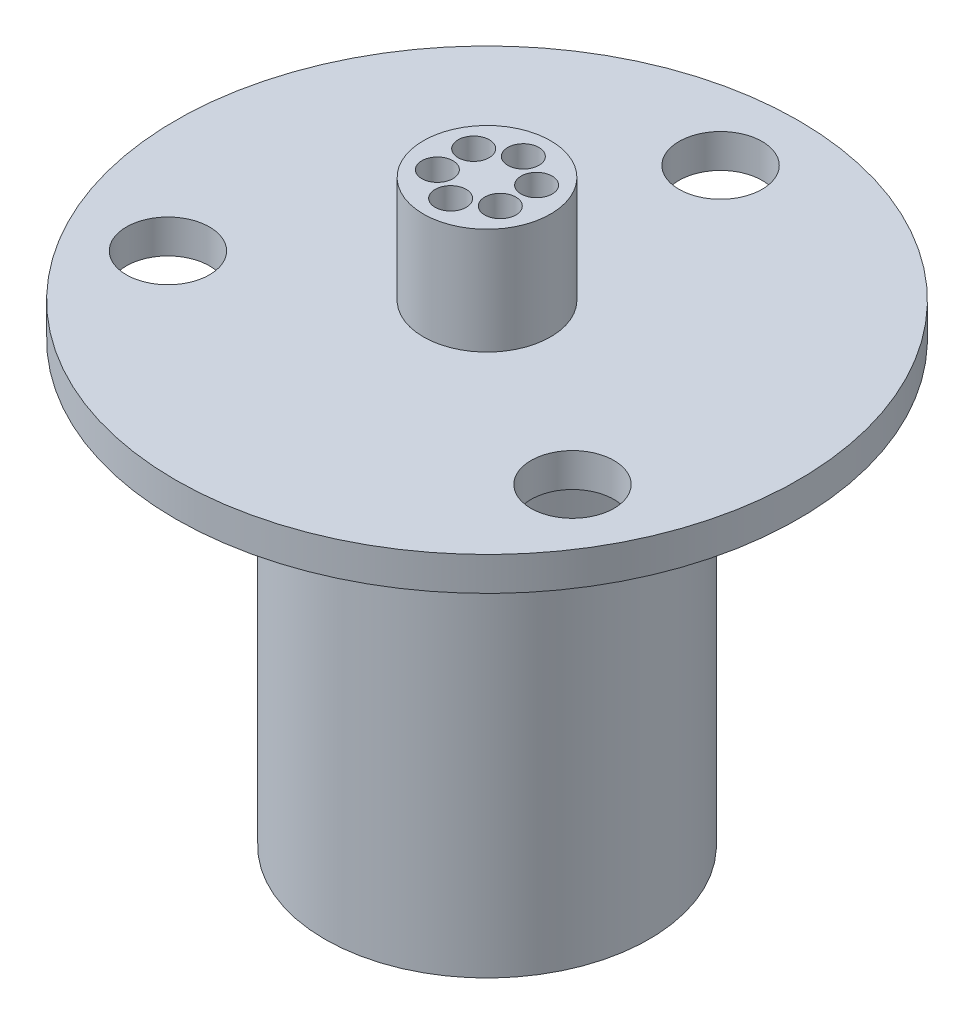
ISO-10303-21;
HEADER;
FILE_DESCRIPTION(('STEP AP214'),'2;1');
FILE_NAME('part.step','',(''),(''),'','','');
FILE_SCHEMA(('AUTOMOTIVE_DESIGN { 1 0 10303 214 1 1 1 1 }'));
ENDSEC;
DATA;
#1=APPLICATION_CONTEXT('core data for automotive mechanical design processes');
#2=APPLICATION_PROTOCOL_DEFINITION('international standard','automotive_design',2000,#1);
#3=PRODUCT_CONTEXT('',#1,'mechanical');
#4=PRODUCT('Part','Part','',(#3));
#5=PRODUCT_RELATED_PRODUCT_CATEGORY('part','',(#4));
#6=PRODUCT_DEFINITION_FORMATION('','',#4);
#7=PRODUCT_DEFINITION_CONTEXT('part definition',#1,'design');
#8=PRODUCT_DEFINITION('design','',#6,#7);
#9=PRODUCT_DEFINITION_SHAPE('','',#8);
#10=(LENGTH_UNIT() NAMED_UNIT(*) SI_UNIT(.MILLI.,.METRE.));
#11=(NAMED_UNIT(*) PLANE_ANGLE_UNIT() SI_UNIT($,.RADIAN.));
#12=(NAMED_UNIT(*) SI_UNIT($,.STERADIAN.) SOLID_ANGLE_UNIT());
#13=UNCERTAINTY_MEASURE_WITH_UNIT(LENGTH_MEASURE(1.E-05),#10,'distance_accuracy_value','');
#14=(GEOMETRIC_REPRESENTATION_CONTEXT(3) GLOBAL_UNCERTAINTY_ASSIGNED_CONTEXT((#13)) GLOBAL_UNIT_ASSIGNED_CONTEXT((#10,
#11,#12)) REPRESENTATION_CONTEXT('',''));
#15=CARTESIAN_POINT('',(0.,0.,0.));
#16=DIRECTION('',(0.,0.,1.));
#17=DIRECTION('',(1.,0.,0.));
#18=AXIS2_PLACEMENT_3D('',#15,#16,#17);
#19=CARTESIAN_POINT('',(0.,16.9,0.));
#20=DIRECTION('',(0.,-1.,0.));
#21=DIRECTION('',(0.,0.,-1.));
#22=AXIS2_PLACEMENT_3D('',#19,#20,#21);
#23=CYLINDRICAL_SURFACE('',#22,6.25);
#24=CARTESIAN_POINT('',(0.,16.9,0.));
#25=DIRECTION('',(0.,1.,0.));
#26=DIRECTION('',(0.,0.,1.));
#27=AXIS2_PLACEMENT_3D('',#24,#25,#26);
#28=CIRCLE('',#27,6.25);
#29=CARTESIAN_POINT('',(0.,16.9,6.25));
#30=VERTEX_POINT('',#29);
#31=EDGE_CURVE('E10',#30,#30,#28,.T.);
#32=ORIENTED_EDGE('',*,*,#31,.F.);
#33=EDGE_LOOP('',(#32));
#34=FACE_BOUND('',#33,.T.);
#35=CARTESIAN_POINT('',(0.,0.,0.));
#36=DIRECTION('',(0.,1.,0.));
#37=DIRECTION('',(0.,0.,1.));
#38=AXIS2_PLACEMENT_3D('',#35,#36,#37);
#39=CIRCLE('',#38,6.25);
#40=CARTESIAN_POINT('',(0.,0.,6.25));
#41=VERTEX_POINT('',#40);
#42=EDGE_CURVE('E51',#41,#41,#39,.T.);
#43=ORIENTED_EDGE('',*,*,#42,.T.);
#44=EDGE_LOOP('',(#43));
#45=FACE_BOUND('',#44,.T.);
#46=ADVANCED_FACE('F43',(#34,#45),#23,.T.);
#47=CARTESIAN_POINT('',(0.,0.,0.));
#48=DIRECTION('',(0.,1.,0.));
#49=DIRECTION('',(0.,0.,1.));
#50=AXIS2_PLACEMENT_3D('',#47,#48,#49);
#51=PLANE('',#50);
#52=CARTESIAN_POINT('',(1.90178217783322,0.,4.07838504166507));
#53=DIRECTION('',(0.,-1.,0.));
#54=DIRECTION('',(0.,0.,-1.));
#55=AXIS2_PLACEMENT_3D('',#52,#53,#54);
#56=CIRCLE('',#55,0.59999999999995);
#57=CARTESIAN_POINT('',(1.90178217783322,0.,3.47838504166512));
#58=VERTEX_POINT('',#57);
#59=EDGE_CURVE('E157',#58,#58,#56,.T.);
#60=ORIENTED_EDGE('',*,*,#59,.F.);
#61=EDGE_LOOP('',(#60));
#62=FACE_BOUND('',#61,.T.);
#63=CARTESIAN_POINT('',(-1.90178217783322,0.,4.07838504166507));
#64=DIRECTION('',(0.,-1.,0.));
#65=DIRECTION('',(0.,0.,1.));
#66=AXIS2_PLACEMENT_3D('',#63,#64,#65);
#67=CIRCLE('',#66,0.59999999999995);
#68=CARTESIAN_POINT('',(-1.90178217783322,0.,4.67838504166502));
#69=VERTEX_POINT('',#68);
#70=EDGE_CURVE('E182',#69,#69,#67,.T.);
#71=ORIENTED_EDGE('',*,*,#70,.F.);
#72=EDGE_LOOP('',(#71));
#73=FACE_BOUND('',#72,.T.);
#74=CARTESIAN_POINT('',(-1.90178217783322,0.,-4.07838504166507));
#75=DIRECTION('',(0.,-1.,0.));
#76=DIRECTION('',(0.,0.,-1.));
#77=AXIS2_PLACEMENT_3D('',#74,#75,#76);
#78=CIRCLE('',#77,0.59999999999995);
#79=CARTESIAN_POINT('',(-1.90178217783322,0.,-4.67838504166502));
#80=VERTEX_POINT('',#79);
#81=EDGE_CURVE('E174',#80,#80,#78,.T.);
#82=ORIENTED_EDGE('',*,*,#81,.F.);
#83=EDGE_LOOP('',(#82));
#84=FACE_BOUND('',#83,.T.);
#85=CARTESIAN_POINT('',(1.90178217783322,0.,-4.07838504166507));
#86=DIRECTION('',(0.,-1.,0.));
#87=DIRECTION('',(0.,0.,1.));
#88=AXIS2_PLACEMENT_3D('',#85,#86,#87);
#89=CIRCLE('',#88,0.59999999999995);
#90=CARTESIAN_POINT('',(1.90178217783322,0.,-3.47838504166512));
#91=VERTEX_POINT('',#90);
#92=EDGE_CURVE('E165',#91,#91,#89,.T.);
#93=ORIENTED_EDGE('',*,*,#92,.F.);
#94=EDGE_LOOP('',(#93));
#95=FACE_BOUND('',#94,.T.);
#96=CARTESIAN_POINT('',(0.,0.,-4.5));
#97=DIRECTION('',(0.,-1.,0.));
#98=DIRECTION('',(0.,0.,1.));
#99=AXIS2_PLACEMENT_3D('',#96,#97,#98);
#100=CIRCLE('',#99,0.6);
#101=CARTESIAN_POINT('',(0.,0.,-3.9));
#102=VERTEX_POINT('',#101);
#103=EDGE_CURVE('E166',#102,#102,#100,.T.);
#104=ORIENTED_EDGE('',*,*,#103,.F.);
#105=EDGE_LOOP('',(#104));
#106=FACE_BOUND('',#105,.T.);
#107=CARTESIAN_POINT('',(0.,0.,4.5));
#108=DIRECTION('',(0.,-1.,0.));
#109=DIRECTION('',(0.,0.,-1.));
#110=AXIS2_PLACEMENT_3D('',#107,#108,#109);
#111=CIRCLE('',#110,0.6);
#112=CARTESIAN_POINT('',(0.,0.,3.9));
#113=VERTEX_POINT('',#112);
#114=EDGE_CURVE('E153',#113,#113,#111,.T.);
#115=ORIENTED_EDGE('',*,*,#114,.F.);
#116=EDGE_LOOP('',(#115));
#117=FACE_BOUND('',#116,.T.);
#118=ORIENTED_EDGE('',*,*,#42,.F.);
#119=EDGE_LOOP('',(#118));
#120=FACE_BOUND('',#119,.T.);
#121=ADVANCED_FACE('F203',(#62,#73,#84,#95,#106,#117,#120),#51,.F.);
#122=CARTESIAN_POINT('',(0.,18.2,0.));
#123=DIRECTION('',(0.,-1.,0.));
#124=DIRECTION('',(0.,0.,-1.));
#125=AXIS2_PLACEMENT_3D('',#122,#123,#124);
#126=CYLINDRICAL_SURFACE('',#125,12.);
#127=CARTESIAN_POINT('',(0.,18.2,0.));
#128=DIRECTION('',(0.,1.,0.));
#129=DIRECTION('',(0.,0.,1.));
#130=AXIS2_PLACEMENT_3D('',#127,#128,#129);
#131=CIRCLE('',#130,12.);
#132=CARTESIAN_POINT('',(0.,18.2,12.));
#133=VERTEX_POINT('',#132);
#134=EDGE_CURVE('E57',#133,#133,#131,.T.);
#135=ORIENTED_EDGE('',*,*,#134,.F.);
#136=EDGE_LOOP('',(#135));
#137=FACE_BOUND('',#136,.T.);
#138=CARTESIAN_POINT('',(0.,16.9,0.));
#139=DIRECTION('',(0.,1.,0.));
#140=DIRECTION('',(0.,0.,1.));
#141=AXIS2_PLACEMENT_3D('',#138,#139,#140);
#142=CIRCLE('',#141,12.);
#143=CARTESIAN_POINT('',(0.,16.9,12.));
#144=VERTEX_POINT('',#143);
#145=EDGE_CURVE('E60',#144,#144,#142,.T.);
#146=ORIENTED_EDGE('',*,*,#145,.T.);
#147=EDGE_LOOP('',(#146));
#148=FACE_BOUND('',#147,.T.);
#149=ADVANCED_FACE('F206',(#137,#148),#126,.T.);
#150=CARTESIAN_POINT('',(0.,18.2,0.));
#151=DIRECTION('',(0.,1.,0.));
#152=DIRECTION('',(0.,0.,1.));
#153=AXIS2_PLACEMENT_3D('',#150,#151,#152);
#154=PLANE('',#153);
#155=CARTESIAN_POINT('',(0.,18.2,0.));
#156=DIRECTION('',(0.,1.,0.));
#157=DIRECTION('',(0.,0.,1.));
#158=AXIS2_PLACEMENT_3D('',#155,#156,#157);
#159=CIRCLE('',#158,2.45);
#160=CARTESIAN_POINT('',(0.,18.2,2.45));
#161=VERTEX_POINT('',#160);
#162=EDGE_CURVE('E97',#161,#161,#159,.T.);
#163=ORIENTED_EDGE('',*,*,#162,.F.);
#164=EDGE_LOOP('',(#163));
#165=FACE_BOUND('',#164,.T.);
#166=CARTESIAN_POINT('',(0.,18.2,-9.));
#167=DIRECTION('',(0.,1.,0.));
#168=DIRECTION('',(0.,0.,1.));
#169=AXIS2_PLACEMENT_3D('',#166,#167,#168);
#170=CIRCLE('',#169,1.6);
#171=CARTESIAN_POINT('',(0.,18.2,-7.4));
#172=VERTEX_POINT('',#171);
#173=EDGE_CURVE('E67',#172,#172,#170,.T.);
#174=ORIENTED_EDGE('',*,*,#173,.F.);
#175=EDGE_LOOP('',(#174));
#176=FACE_BOUND('',#175,.T.);
#177=CARTESIAN_POINT('',(7.79422863406052,18.2,4.49999999999967));
#178=DIRECTION('',(0.,1.,0.));
#179=DIRECTION('',(0.,0.,1.));
#180=AXIS2_PLACEMENT_3D('',#177,#178,#179);
#181=CIRCLE('',#180,1.60000000000049);
#182=CARTESIAN_POINT('',(7.79422863406052,18.2,6.10000000000016));
#183=VERTEX_POINT('',#182);
#184=EDGE_CURVE('E89',#183,#183,#181,.T.);
#185=ORIENTED_EDGE('',*,*,#184,.F.);
#186=EDGE_LOOP('',(#185));
#187=FACE_BOUND('',#186,.T.);
#188=CARTESIAN_POINT('',(-7.79422863405937,18.2,4.50000000000033));
#189=DIRECTION('',(0.,1.,0.));
#190=DIRECTION('',(0.,0.,1.));
#191=AXIS2_PLACEMENT_3D('',#188,#189,#190);
#192=CIRCLE('',#191,1.60000000000073);
#193=CARTESIAN_POINT('',(-7.79422863405937,18.2,6.10000000000106));
#194=VERTEX_POINT('',#193);
#195=EDGE_CURVE('E85',#194,#194,#192,.T.);
#196=ORIENTED_EDGE('',*,*,#195,.F.);
#197=EDGE_LOOP('',(#196));
#198=FACE_BOUND('',#197,.T.);
#199=ORIENTED_EDGE('',*,*,#134,.T.);
#200=EDGE_LOOP('',(#199));
#201=FACE_BOUND('',#200,.T.);
#202=ADVANCED_FACE('F228',(#165,#176,#187,#198,#201),#154,.T.);
#203=CARTESIAN_POINT('',(0.,16.9,0.));
#204=DIRECTION('',(0.,1.,0.));
#205=DIRECTION('',(0.,0.,1.));
#206=AXIS2_PLACEMENT_3D('',#203,#204,#205);
#207=PLANE('',#206);
#208=CARTESIAN_POINT('',(0.,16.9,-9.));
#209=DIRECTION('',(0.,1.,0.));
#210=DIRECTION('',(0.,0.,1.));
#211=AXIS2_PLACEMENT_3D('',#208,#209,#210);
#212=CIRCLE('',#211,1.6);
#213=CARTESIAN_POINT('',(0.,16.9,-7.4));
#214=VERTEX_POINT('',#213);
#215=EDGE_CURVE('E46',#214,#214,#212,.T.);
#216=ORIENTED_EDGE('',*,*,#215,.T.);
#217=EDGE_LOOP('',(#216));
#218=FACE_BOUND('',#217,.T.);
#219=CARTESIAN_POINT('',(7.79422863406052,16.9,4.49999999999967));
#220=DIRECTION('',(0.,1.,0.));
#221=DIRECTION('',(0.,0.,1.));
#222=AXIS2_PLACEMENT_3D('',#219,#220,#221);
#223=CIRCLE('',#222,1.60000000000049);
#224=CARTESIAN_POINT('',(7.79422863406052,16.9,6.10000000000016));
#225=VERTEX_POINT('',#224);
#226=EDGE_CURVE('E66',#225,#225,#223,.T.);
#227=ORIENTED_EDGE('',*,*,#226,.T.);
#228=EDGE_LOOP('',(#227));
#229=FACE_BOUND('',#228,.T.);
#230=CARTESIAN_POINT('',(-7.79422863405937,16.9,4.50000000000033));
#231=DIRECTION('',(0.,1.,0.));
#232=DIRECTION('',(0.,0.,1.));
#233=AXIS2_PLACEMENT_3D('',#230,#231,#232);
#234=CIRCLE('',#233,1.60000000000073);
#235=CARTESIAN_POINT('',(-7.79422863405937,16.9,6.10000000000106));
#236=VERTEX_POINT('',#235);
#237=EDGE_CURVE('E63',#236,#236,#234,.T.);
#238=ORIENTED_EDGE('',*,*,#237,.T.);
#239=EDGE_LOOP('',(#238));
#240=FACE_BOUND('',#239,.T.);
#241=ORIENTED_EDGE('',*,*,#31,.T.);
#242=EDGE_LOOP('',(#241));
#243=FACE_BOUND('',#242,.T.);
#244=ORIENTED_EDGE('',*,*,#145,.F.);
#245=EDGE_LOOP('',(#244));
#246=FACE_BOUND('',#245,.T.);
#247=ADVANCED_FACE('F237',(#218,#229,#240,#243,#246),#207,.F.);
#248=CARTESIAN_POINT('',(-7.79422863405937,0.,4.50000000000033));
#249=DIRECTION('',(0.,1.,0.));
#250=DIRECTION('',(0.,0.,1.));
#251=AXIS2_PLACEMENT_3D('',#248,#249,#250);
#252=CYLINDRICAL_SURFACE('',#251,1.60000000000073);
#253=ORIENTED_EDGE('',*,*,#195,.T.);
#254=EDGE_LOOP('',(#253));
#255=FACE_BOUND('',#254,.T.);
#256=ORIENTED_EDGE('',*,*,#237,.F.);
#257=EDGE_LOOP('',(#256));
#258=FACE_BOUND('',#257,.T.);
#259=ADVANCED_FACE('F246',(#255,#258),#252,.F.);
#260=CARTESIAN_POINT('',(7.79422863406052,0.,4.49999999999967));
#261=DIRECTION('',(0.,1.,0.));
#262=DIRECTION('',(0.,0.,1.));
#263=AXIS2_PLACEMENT_3D('',#260,#261,#262);
#264=CYLINDRICAL_SURFACE('',#263,1.60000000000049);
#265=ORIENTED_EDGE('',*,*,#184,.T.);
#266=EDGE_LOOP('',(#265));
#267=FACE_BOUND('',#266,.T.);
#268=ORIENTED_EDGE('',*,*,#226,.F.);
#269=EDGE_LOOP('',(#268));
#270=FACE_BOUND('',#269,.T.);
#271=ADVANCED_FACE('F253',(#267,#270),#264,.F.);
#272=CARTESIAN_POINT('',(0.,0.,-9.));
#273=DIRECTION('',(0.,1.,0.));
#274=DIRECTION('',(0.,0.,1.));
#275=AXIS2_PLACEMENT_3D('',#272,#273,#274);
#276=CYLINDRICAL_SURFACE('',#275,1.6);
#277=ORIENTED_EDGE('',*,*,#173,.T.);
#278=EDGE_LOOP('',(#277));
#279=FACE_BOUND('',#278,.T.);
#280=ORIENTED_EDGE('',*,*,#215,.F.);
#281=EDGE_LOOP('',(#280));
#282=FACE_BOUND('',#281,.T.);
#283=ADVANCED_FACE('F261',(#279,#282),#276,.F.);
#284=CARTESIAN_POINT('',(0.,22.3,0.));
#285=DIRECTION('',(0.,-1.,0.));
#286=DIRECTION('',(0.,0.,-1.));
#287=AXIS2_PLACEMENT_3D('',#284,#285,#286);
#288=CYLINDRICAL_SURFACE('',#287,2.45);
#289=CARTESIAN_POINT('',(0.,22.3,0.));
#290=DIRECTION('',(0.,1.,0.));
#291=DIRECTION('',(0.,0.,1.));
#292=AXIS2_PLACEMENT_3D('',#289,#290,#291);
#293=CIRCLE('',#292,2.45);
#294=CARTESIAN_POINT('',(0.,22.3,2.45));
#295=VERTEX_POINT('',#294);
#296=EDGE_CURVE('E90',#295,#295,#293,.T.);
#297=ORIENTED_EDGE('',*,*,#296,.F.);
#298=EDGE_LOOP('',(#297));
#299=FACE_BOUND('',#298,.T.);
#300=ORIENTED_EDGE('',*,*,#162,.T.);
#301=EDGE_LOOP('',(#300));
#302=FACE_BOUND('',#301,.T.);
#303=ADVANCED_FACE('F268',(#299,#302),#288,.T.);
#304=CARTESIAN_POINT('',(0.,22.3,0.));
#305=DIRECTION('',(0.,1.,0.));
#306=DIRECTION('',(0.,0.,1.));
#307=AXIS2_PLACEMENT_3D('',#304,#305,#306);
#308=PLANE('',#307);
#309=CARTESIAN_POINT('',(1.21243556529824,22.3,-0.700000000000052));
#310=DIRECTION('',(0.,1.,0.));
#311=DIRECTION('',(0.,0.,1.));
#312=AXIS2_PLACEMENT_3D('',#309,#310,#311);
#313=CIRCLE('',#312,0.600000000000017);
#314=CARTESIAN_POINT('',(1.21243556529824,22.3,-0.100000000000035));
#315=VERTEX_POINT('',#314);
#316=EDGE_CURVE('E109',#315,#315,#313,.T.);
#317=ORIENTED_EDGE('',*,*,#316,.F.);
#318=EDGE_LOOP('',(#317));
#319=FACE_BOUND('',#318,.T.);
#320=CARTESIAN_POINT('',(1.2124355652983,22.3,0.699999999999948));
#321=DIRECTION('',(0.,1.,0.));
#322=DIRECTION('',(0.,0.,1.));
#323=AXIS2_PLACEMENT_3D('',#320,#321,#322);
#324=CIRCLE('',#323,0.600000000000077);
#325=CARTESIAN_POINT('',(1.2124355652983,22.3,1.30000000000003));
#326=VERTEX_POINT('',#325);
#327=EDGE_CURVE('E134',#326,#326,#324,.T.);
#328=ORIENTED_EDGE('',*,*,#327,.F.);
#329=EDGE_LOOP('',(#328));
#330=FACE_BOUND('',#329,.T.);
#331=CARTESIAN_POINT('',(1.18856827952055E-13,22.3,1.4));
#332=DIRECTION('',(0.,1.,0.));
#333=DIRECTION('',(0.,0.,1.));
#334=AXIS2_PLACEMENT_3D('',#331,#332,#333);
#335=CIRCLE('',#334,0.600000000000123);
#336=CARTESIAN_POINT('',(1.18856827952055E-13,22.3,2.00000000000012));
#337=VERTEX_POINT('',#336);
#338=EDGE_CURVE('E126',#337,#337,#335,.T.);
#339=ORIENTED_EDGE('',*,*,#338,.F.);
#340=EDGE_LOOP('',(#339));
#341=FACE_BOUND('',#340,.T.);
#342=CARTESIAN_POINT('',(-1.21243556529812,22.3,0.700000000000052));
#343=DIRECTION('',(0.,1.,0.));
#344=DIRECTION('',(0.,0.,1.));
#345=AXIS2_PLACEMENT_3D('',#342,#343,#344);
#346=CIRCLE('',#345,0.600000000000113);
#347=CARTESIAN_POINT('',(-1.21243556529812,22.3,1.30000000000017));
#348=VERTEX_POINT('',#347);
#349=EDGE_CURVE('E117',#348,#348,#346,.T.);
#350=ORIENTED_EDGE('',*,*,#349,.F.);
#351=EDGE_LOOP('',(#350));
#352=FACE_BOUND('',#351,.T.);
#353=CARTESIAN_POINT('',(-1.21243556529819,22.3,-0.699999999999948));
#354=DIRECTION('',(0.,1.,0.));
#355=DIRECTION('',(0.,0.,1.));
#356=AXIS2_PLACEMENT_3D('',#353,#354,#355);
#357=CIRCLE('',#356,0.60000000000006);
#358=CARTESIAN_POINT('',(-1.21243556529819,22.3,-0.0999999999998876));
#359=VERTEX_POINT('',#358);
#360=EDGE_CURVE('E118',#359,#359,#357,.T.);
#361=ORIENTED_EDGE('',*,*,#360,.F.);
#362=EDGE_LOOP('',(#361));
#363=FACE_BOUND('',#362,.T.);
#364=CARTESIAN_POINT('',(0.,22.3,-1.4));
#365=DIRECTION('',(0.,1.,0.));
#366=DIRECTION('',(0.,0.,1.));
#367=AXIS2_PLACEMENT_3D('',#364,#365,#366);
#368=CIRCLE('',#367,0.6);
#369=CARTESIAN_POINT('',(0.,22.3,-0.8));
#370=VERTEX_POINT('',#369);
#371=EDGE_CURVE('E105',#370,#370,#368,.T.);
#372=ORIENTED_EDGE('',*,*,#371,.F.);
#373=EDGE_LOOP('',(#372));
#374=FACE_BOUND('',#373,.T.);
#375=ORIENTED_EDGE('',*,*,#296,.T.);
#376=EDGE_LOOP('',(#375));
#377=FACE_BOUND('',#376,.T.);
#378=ADVANCED_FACE('F275',(#319,#330,#341,#352,#363,#374,#377),#308,.T.);
#379=CARTESIAN_POINT('',(0.,21.3,-1.4));
#380=DIRECTION('',(0.,1.,0.));
#381=DIRECTION('',(0.,0.,1.));
#382=AXIS2_PLACEMENT_3D('',#379,#380,#381);
#383=CYLINDRICAL_SURFACE('',#382,0.6);
#384=CARTESIAN_POINT('',(0.,21.3,-1.4));
#385=DIRECTION('',(0.,1.,0.));
#386=DIRECTION('',(0.,0.,1.));
#387=AXIS2_PLACEMENT_3D('',#384,#385,#386);
#388=CIRCLE('',#387,0.6);
#389=CARTESIAN_POINT('',(0.,21.3,-0.8));
#390=VERTEX_POINT('',#389);
#391=EDGE_CURVE('E101',#390,#390,#388,.T.);
#392=ORIENTED_EDGE('',*,*,#391,.F.);
#393=EDGE_LOOP('',(#392));
#394=FACE_BOUND('',#393,.T.);
#395=ORIENTED_EDGE('',*,*,#371,.T.);
#396=EDGE_LOOP('',(#395));
#397=FACE_BOUND('',#396,.T.);
#398=ADVANCED_FACE('F283',(#394,#397),#383,.F.);
#399=CARTESIAN_POINT('',(0.,21.3,-1.4));
#400=DIRECTION('',(0.,1.,0.));
#401=DIRECTION('',(0.,0.,1.));
#402=AXIS2_PLACEMENT_3D('',#399,#400,#401);
#403=PLANE('',#402);
#404=ORIENTED_EDGE('',*,*,#391,.T.);
#405=EDGE_LOOP('',(#404));
#406=FACE_BOUND('',#405,.T.);
#407=ADVANCED_FACE('F292',(#406),#403,.T.);
#408=CARTESIAN_POINT('',(-1.21243556529819,21.3,-0.699999999999948));
#409=DIRECTION('',(0.,1.,0.));
#410=DIRECTION('',(0.,0.,1.));
#411=AXIS2_PLACEMENT_3D('',#408,#409,#410);
#412=CYLINDRICAL_SURFACE('',#411,0.60000000000006);
#413=CARTESIAN_POINT('',(-1.21243556529819,21.3,-0.699999999999948));
#414=DIRECTION('',(0.,1.,0.));
#415=DIRECTION('',(0.,0.,1.));
#416=AXIS2_PLACEMENT_3D('',#413,#414,#415);
#417=CIRCLE('',#416,0.60000000000006);
#418=CARTESIAN_POINT('',(-1.21243556529819,21.3,-0.0999999999998876));
#419=VERTEX_POINT('',#418);
#420=EDGE_CURVE('E145',#419,#419,#417,.T.);
#421=ORIENTED_EDGE('',*,*,#420,.F.);
#422=EDGE_LOOP('',(#421));
#423=FACE_BOUND('',#422,.T.);
#424=ORIENTED_EDGE('',*,*,#360,.T.);
#425=EDGE_LOOP('',(#424));
#426=FACE_BOUND('',#425,.T.);
#427=ADVANCED_FACE('F300',(#423,#426),#412,.F.);
#428=CARTESIAN_POINT('',(-1.21243556529819,21.3,-0.699999999999948));
#429=DIRECTION('',(0.,1.,0.));
#430=DIRECTION('',(0.,0.,1.));
#431=AXIS2_PLACEMENT_3D('',#428,#429,#430);
#432=PLANE('',#431);
#433=ORIENTED_EDGE('',*,*,#420,.T.);
#434=EDGE_LOOP('',(#433));
#435=FACE_BOUND('',#434,.T.);
#436=ADVANCED_FACE('F309',(#435),#432,.T.);
#437=CARTESIAN_POINT('',(-1.21243556529812,21.3,0.700000000000052));
#438=DIRECTION('',(0.,1.,0.));
#439=DIRECTION('',(0.,0.,1.));
#440=AXIS2_PLACEMENT_3D('',#437,#438,#439);
#441=CYLINDRICAL_SURFACE('',#440,0.600000000000113);
#442=CARTESIAN_POINT('',(-1.21243556529812,21.3,0.700000000000052));
#443=DIRECTION('',(0.,1.,0.));
#444=DIRECTION('',(0.,0.,1.));
#445=AXIS2_PLACEMENT_3D('',#442,#443,#444);
#446=CIRCLE('',#445,0.600000000000113);
#447=CARTESIAN_POINT('',(-1.21243556529812,21.3,1.30000000000017));
#448=VERTEX_POINT('',#447);
#449=EDGE_CURVE('E113',#448,#448,#446,.T.);
#450=ORIENTED_EDGE('',*,*,#449,.F.);
#451=EDGE_LOOP('',(#450));
#452=FACE_BOUND('',#451,.T.);
#453=ORIENTED_EDGE('',*,*,#349,.T.);
#454=EDGE_LOOP('',(#453));
#455=FACE_BOUND('',#454,.T.);
#456=ADVANCED_FACE('F317',(#452,#455),#441,.F.);
#457=CARTESIAN_POINT('',(-1.21243556529812,21.3,0.700000000000052));
#458=DIRECTION('',(0.,1.,0.));
#459=DIRECTION('',(0.,0.,1.));
#460=AXIS2_PLACEMENT_3D('',#457,#458,#459);
#461=PLANE('',#460);
#462=ORIENTED_EDGE('',*,*,#449,.T.);
#463=EDGE_LOOP('',(#462));
#464=FACE_BOUND('',#463,.T.);
#465=ADVANCED_FACE('F325',(#464),#461,.T.);
#466=CARTESIAN_POINT('',(1.18856827952055E-13,21.3,1.4));
#467=DIRECTION('',(0.,1.,0.));
#468=DIRECTION('',(0.,0.,1.));
#469=AXIS2_PLACEMENT_3D('',#466,#467,#468);
#470=CYLINDRICAL_SURFACE('',#469,0.600000000000123);
#471=CARTESIAN_POINT('',(1.18856827952055E-13,21.3,1.4));
#472=DIRECTION('',(0.,1.,0.));
#473=DIRECTION('',(0.,0.,1.));
#474=AXIS2_PLACEMENT_3D('',#471,#472,#473);
#475=CIRCLE('',#474,0.600000000000123);
#476=CARTESIAN_POINT('',(1.18856827952055E-13,21.3,2.00000000000012));
#477=VERTEX_POINT('',#476);
#478=EDGE_CURVE('E122',#477,#477,#475,.T.);
#479=ORIENTED_EDGE('',*,*,#478,.F.);
#480=EDGE_LOOP('',(#479));
#481=FACE_BOUND('',#480,.T.);
#482=ORIENTED_EDGE('',*,*,#338,.T.);
#483=EDGE_LOOP('',(#482));
#484=FACE_BOUND('',#483,.T.);
#485=ADVANCED_FACE('F334',(#481,#484),#470,.F.);
#486=CARTESIAN_POINT('',(1.18856827952055E-13,21.3,1.4));
#487=DIRECTION('',(0.,1.,0.));
#488=DIRECTION('',(0.,0.,1.));
#489=AXIS2_PLACEMENT_3D('',#486,#487,#488);
#490=PLANE('',#489);
#491=ORIENTED_EDGE('',*,*,#478,.T.);
#492=EDGE_LOOP('',(#491));
#493=FACE_BOUND('',#492,.T.);
#494=ADVANCED_FACE('F343',(#493),#490,.T.);
#495=CARTESIAN_POINT('',(1.2124355652983,21.3,0.699999999999948));
#496=DIRECTION('',(0.,1.,0.));
#497=DIRECTION('',(0.,0.,1.));
#498=AXIS2_PLACEMENT_3D('',#495,#496,#497);
#499=CYLINDRICAL_SURFACE('',#498,0.600000000000077);
#500=CARTESIAN_POINT('',(1.2124355652983,21.3,0.699999999999948));
#501=DIRECTION('',(0.,1.,0.));
#502=DIRECTION('',(0.,0.,1.));
#503=AXIS2_PLACEMENT_3D('',#500,#501,#502);
#504=CIRCLE('',#503,0.600000000000077);
#505=CARTESIAN_POINT('',(1.2124355652983,21.3,1.30000000000003));
#506=VERTEX_POINT('',#505);
#507=EDGE_CURVE('E130',#506,#506,#504,.T.);
#508=ORIENTED_EDGE('',*,*,#507,.F.);
#509=EDGE_LOOP('',(#508));
#510=FACE_BOUND('',#509,.T.);
#511=ORIENTED_EDGE('',*,*,#327,.T.);
#512=EDGE_LOOP('',(#511));
#513=FACE_BOUND('',#512,.T.);
#514=ADVANCED_FACE('F351',(#510,#513),#499,.F.);
#515=CARTESIAN_POINT('',(1.2124355652983,21.3,0.699999999999948));
#516=DIRECTION('',(0.,1.,0.));
#517=DIRECTION('',(0.,0.,1.));
#518=AXIS2_PLACEMENT_3D('',#515,#516,#517);
#519=PLANE('',#518);
#520=ORIENTED_EDGE('',*,*,#507,.T.);
#521=EDGE_LOOP('',(#520));
#522=FACE_BOUND('',#521,.T.);
#523=ADVANCED_FACE('F360',(#522),#519,.T.);
#524=CARTESIAN_POINT('',(1.21243556529824,21.3,-0.700000000000052));
#525=DIRECTION('',(0.,1.,0.));
#526=DIRECTION('',(0.,0.,1.));
#527=AXIS2_PLACEMENT_3D('',#524,#525,#526);
#528=CYLINDRICAL_SURFACE('',#527,0.600000000000017);
#529=CARTESIAN_POINT('',(1.21243556529824,21.3,-0.700000000000052));
#530=DIRECTION('',(0.,1.,0.));
#531=DIRECTION('',(0.,0.,1.));
#532=AXIS2_PLACEMENT_3D('',#529,#530,#531);
#533=CIRCLE('',#532,0.600000000000017);
#534=CARTESIAN_POINT('',(1.21243556529824,21.3,-0.100000000000035));
#535=VERTEX_POINT('',#534);
#536=EDGE_CURVE('E138',#535,#535,#533,.T.);
#537=ORIENTED_EDGE('',*,*,#536,.F.);
#538=EDGE_LOOP('',(#537));
#539=FACE_BOUND('',#538,.T.);
#540=ORIENTED_EDGE('',*,*,#316,.T.);
#541=EDGE_LOOP('',(#540));
#542=FACE_BOUND('',#541,.T.);
#543=ADVANCED_FACE('F368',(#539,#542),#528,.F.);
#544=CARTESIAN_POINT('',(1.21243556529824,21.3,-0.700000000000052));
#545=DIRECTION('',(0.,1.,0.));
#546=DIRECTION('',(0.,0.,1.));
#547=AXIS2_PLACEMENT_3D('',#544,#545,#546);
#548=PLANE('',#547);
#549=ORIENTED_EDGE('',*,*,#536,.T.);
#550=EDGE_LOOP('',(#549));
#551=FACE_BOUND('',#550,.T.);
#552=ADVANCED_FACE('F377',(#551),#548,.T.);
#553=CARTESIAN_POINT('',(0.,1.,4.5));
#554=DIRECTION('',(0.,-1.,0.));
#555=DIRECTION('',(0.,0.,-1.));
#556=AXIS2_PLACEMENT_3D('',#553,#554,#555);
#557=CYLINDRICAL_SURFACE('',#556,0.6);
#558=CARTESIAN_POINT('',(0.,1.,4.5));
#559=DIRECTION('',(0.,-1.,0.));
#560=DIRECTION('',(0.,0.,-1.));
#561=AXIS2_PLACEMENT_3D('',#558,#559,#560);
#562=CIRCLE('',#561,0.6);
#563=CARTESIAN_POINT('',(0.,1.,3.9));
#564=VERTEX_POINT('',#563);
#565=EDGE_CURVE('E149',#564,#564,#562,.T.);
#566=ORIENTED_EDGE('',*,*,#565,.F.);
#567=EDGE_LOOP('',(#566));
#568=FACE_BOUND('',#567,.T.);
#569=ORIENTED_EDGE('',*,*,#114,.T.);
#570=EDGE_LOOP('',(#569));
#571=FACE_BOUND('',#570,.T.);
#572=ADVANCED_FACE('F384',(#568,#571),#557,.F.);
#573=CARTESIAN_POINT('',(0.,1.,4.5));
#574=DIRECTION('',(0.,-1.,0.));
#575=DIRECTION('',(0.,0.,-1.));
#576=AXIS2_PLACEMENT_3D('',#573,#574,#575);
#577=PLANE('',#576);
#578=ORIENTED_EDGE('',*,*,#565,.T.);
#579=EDGE_LOOP('',(#578));
#580=FACE_BOUND('',#579,.T.);
#581=ADVANCED_FACE('F390',(#580),#577,.T.);
#582=CARTESIAN_POINT('',(0.,1.,-4.5));
#583=DIRECTION('',(0.,-1.,0.));
#584=DIRECTION('',(0.,0.,-1.));
#585=AXIS2_PLACEMENT_3D('',#582,#583,#584);
#586=CYLINDRICAL_SURFACE('',#585,0.6);
#587=CARTESIAN_POINT('',(0.,1.,-4.5));
#588=DIRECTION('',(0.,-1.,0.));
#589=DIRECTION('',(0.,0.,1.));
#590=AXIS2_PLACEMENT_3D('',#587,#588,#589);
#591=CIRCLE('',#590,0.6);
#592=CARTESIAN_POINT('',(0.,1.,-3.9));
#593=VERTEX_POINT('',#592);
#594=EDGE_CURVE('E193',#593,#593,#591,.T.);
#595=ORIENTED_EDGE('',*,*,#594,.F.);
#596=EDGE_LOOP('',(#595));
#597=FACE_BOUND('',#596,.T.);
#598=ORIENTED_EDGE('',*,*,#103,.T.);
#599=EDGE_LOOP('',(#598));
#600=FACE_BOUND('',#599,.T.);
#601=ADVANCED_FACE('F201',(#597,#600),#586,.F.);
#602=CARTESIAN_POINT('',(0.,1.,-4.5));
#603=DIRECTION('',(0.,1.,0.));
#604=DIRECTION('',(0.,0.,1.));
#605=AXIS2_PLACEMENT_3D('',#602,#603,#604);
#606=PLANE('',#605);
#607=ORIENTED_EDGE('',*,*,#594,.T.);
#608=EDGE_LOOP('',(#607));
#609=FACE_BOUND('',#608,.T.);
#610=ADVANCED_FACE('F405',(#609),#606,.F.);
#611=CARTESIAN_POINT('',(1.90178217783322,1.,-4.07838504166507));
#612=DIRECTION('',(0.,-1.,0.));
#613=DIRECTION('',(0.,0.,-1.));
#614=AXIS2_PLACEMENT_3D('',#611,#612,#613);
#615=CYLINDRICAL_SURFACE('',#614,0.59999999999995);
#616=CARTESIAN_POINT('',(1.90178217783322,1.,-4.07838504166507));
#617=DIRECTION('',(0.,-1.,0.));
#618=DIRECTION('',(0.,0.,1.));
#619=AXIS2_PLACEMENT_3D('',#616,#617,#618);
#620=CIRCLE('',#619,0.59999999999995);
#621=CARTESIAN_POINT('',(1.90178217783322,1.,-3.47838504166512));
#622=VERTEX_POINT('',#621);
#623=EDGE_CURVE('E161',#622,#622,#620,.T.);
#624=ORIENTED_EDGE('',*,*,#623,.F.);
#625=EDGE_LOOP('',(#624));
#626=FACE_BOUND('',#625,.T.);
#627=ORIENTED_EDGE('',*,*,#92,.T.);
#628=EDGE_LOOP('',(#627));
#629=FACE_BOUND('',#628,.T.);
#630=ADVANCED_FACE('F412',(#626,#629),#615,.F.);
#631=CARTESIAN_POINT('',(1.90178217783322,1.,-4.07838504166507));
#632=DIRECTION('',(0.,1.,0.));
#633=DIRECTION('',(0.,0.,1.));
#634=AXIS2_PLACEMENT_3D('',#631,#632,#633);
#635=PLANE('',#634);
#636=ORIENTED_EDGE('',*,*,#623,.T.);
#637=EDGE_LOOP('',(#636));
#638=FACE_BOUND('',#637,.T.);
#639=ADVANCED_FACE('F421',(#638),#635,.F.);
#640=CARTESIAN_POINT('',(-1.90178217783322,1.,-4.07838504166507));
#641=DIRECTION('',(0.,-1.,0.));
#642=DIRECTION('',(0.,0.,-1.));
#643=AXIS2_PLACEMENT_3D('',#640,#641,#642);
#644=CYLINDRICAL_SURFACE('',#643,0.59999999999995);
#645=CARTESIAN_POINT('',(-1.90178217783322,1.,-4.07838504166507));
#646=DIRECTION('',(0.,-1.,0.));
#647=DIRECTION('',(0.,0.,-1.));
#648=AXIS2_PLACEMENT_3D('',#645,#646,#647);
#649=CIRCLE('',#648,0.59999999999995);
#650=CARTESIAN_POINT('',(-1.90178217783322,1.,-4.67838504166502));
#651=VERTEX_POINT('',#650);
#652=EDGE_CURVE('E170',#651,#651,#649,.T.);
#653=ORIENTED_EDGE('',*,*,#652,.F.);
#654=EDGE_LOOP('',(#653));
#655=FACE_BOUND('',#654,.T.);
#656=ORIENTED_EDGE('',*,*,#81,.T.);
#657=EDGE_LOOP('',(#656));
#658=FACE_BOUND('',#657,.T.);
#659=ADVANCED_FACE('F428',(#655,#658),#644,.F.);
#660=CARTESIAN_POINT('',(-1.90178217783322,1.,-4.07838504166507));
#661=DIRECTION('',(0.,-1.,0.));
#662=DIRECTION('',(0.,0.,-1.));
#663=AXIS2_PLACEMENT_3D('',#660,#661,#662);
#664=PLANE('',#663);
#665=ORIENTED_EDGE('',*,*,#652,.T.);
#666=EDGE_LOOP('',(#665));
#667=FACE_BOUND('',#666,.T.);
#668=ADVANCED_FACE('F435',(#667),#664,.T.);
#669=CARTESIAN_POINT('',(-1.90178217783322,1.,4.07838504166507));
#670=DIRECTION('',(0.,-1.,0.));
#671=DIRECTION('',(0.,0.,-1.));
#672=AXIS2_PLACEMENT_3D('',#669,#670,#671);
#673=CYLINDRICAL_SURFACE('',#672,0.59999999999995);
#674=CARTESIAN_POINT('',(-1.90178217783322,1.,4.07838504166507));
#675=DIRECTION('',(0.,-1.,0.));
#676=DIRECTION('',(0.,0.,1.));
#677=AXIS2_PLACEMENT_3D('',#674,#675,#676);
#678=CIRCLE('',#677,0.59999999999995);
#679=CARTESIAN_POINT('',(-1.90178217783322,1.,4.67838504166502));
#680=VERTEX_POINT('',#679);
#681=EDGE_CURVE('E178',#680,#680,#678,.T.);
#682=ORIENTED_EDGE('',*,*,#681,.F.);
#683=EDGE_LOOP('',(#682));
#684=FACE_BOUND('',#683,.T.);
#685=ORIENTED_EDGE('',*,*,#70,.T.);
#686=EDGE_LOOP('',(#685));
#687=FACE_BOUND('',#686,.T.);
#688=ADVANCED_FACE('F442',(#684,#687),#673,.F.);
#689=CARTESIAN_POINT('',(-1.90178217783322,1.,4.07838504166507));
#690=DIRECTION('',(0.,1.,0.));
#691=DIRECTION('',(0.,0.,1.));
#692=AXIS2_PLACEMENT_3D('',#689,#690,#691);
#693=PLANE('',#692);
#694=ORIENTED_EDGE('',*,*,#681,.T.);
#695=EDGE_LOOP('',(#694));
#696=FACE_BOUND('',#695,.T.);
#697=ADVANCED_FACE('F449',(#696),#693,.F.);
#698=CARTESIAN_POINT('',(1.90178217783322,1.,4.07838504166507));
#699=DIRECTION('',(0.,-1.,0.));
#700=DIRECTION('',(0.,0.,-1.));
#701=AXIS2_PLACEMENT_3D('',#698,#699,#700);
#702=CYLINDRICAL_SURFACE('',#701,0.59999999999995);
#703=CARTESIAN_POINT('',(1.90178217783322,1.,4.07838504166507));
#704=DIRECTION('',(0.,-1.,0.));
#705=DIRECTION('',(0.,0.,-1.));
#706=AXIS2_PLACEMENT_3D('',#703,#704,#705);
#707=CIRCLE('',#706,0.59999999999995);
#708=CARTESIAN_POINT('',(1.90178217783322,1.,3.47838504166512));
#709=VERTEX_POINT('',#708);
#710=EDGE_CURVE('E186',#709,#709,#707,.T.);
#711=ORIENTED_EDGE('',*,*,#710,.F.);
#712=EDGE_LOOP('',(#711));
#713=FACE_BOUND('',#712,.T.);
#714=ORIENTED_EDGE('',*,*,#59,.T.);
#715=EDGE_LOOP('',(#714));
#716=FACE_BOUND('',#715,.T.);
#717=ADVANCED_FACE('F457',(#713,#716),#702,.F.);
#718=CARTESIAN_POINT('',(1.90178217783322,1.,4.07838504166507));
#719=DIRECTION('',(0.,-1.,0.));
#720=DIRECTION('',(0.,0.,-1.));
#721=AXIS2_PLACEMENT_3D('',#718,#719,#720);
#722=PLANE('',#721);
#723=ORIENTED_EDGE('',*,*,#710,.T.);
#724=EDGE_LOOP('',(#723));
#725=FACE_BOUND('',#724,.T.);
#726=ADVANCED_FACE('F465',(#725),#722,.T.);
#727=CLOSED_SHELL('',(#46,#121,#149,#202,#247,#259,#271,#283,#303,#378,#398,#407,#427,#436,#456,
#465,#485,#494,#514,#523,#543,#552,#572,#581,#601,#610,#630,#639,#659,#668,#688,#697,#717,#726));
#728=MANIFOLD_SOLID_BREP('B2',#727);
#729=ADVANCED_BREP_SHAPE_REPRESENTATION('',(#18,#728),#14);
#730=SHAPE_DEFINITION_REPRESENTATION(#9,#729);
ENDSEC;
END-ISO-10303-21;
